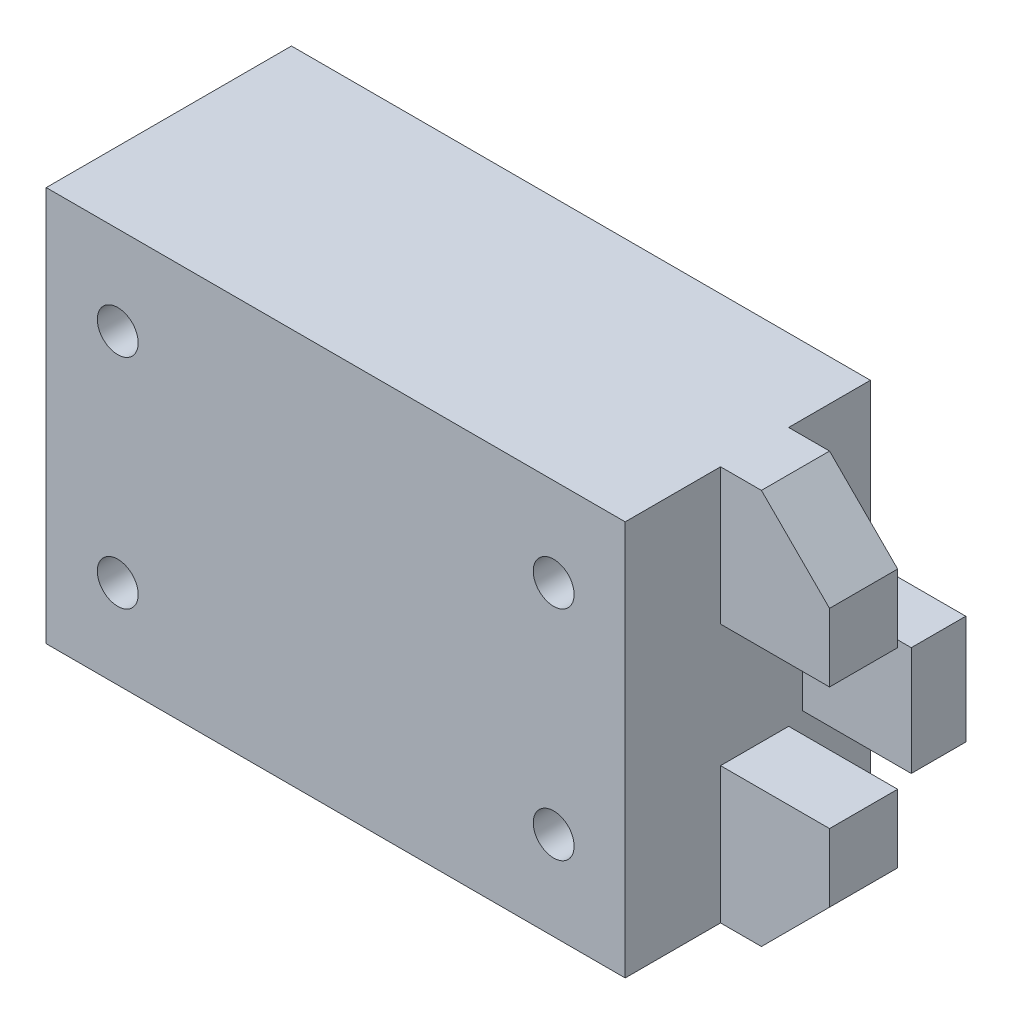
ISO-10303-21;
HEADER;
FILE_DESCRIPTION(('STEP AP214'),'2;1');
FILE_NAME('part.step','',(''),(''),'','','');
FILE_SCHEMA(('AUTOMOTIVE_DESIGN { 1 0 10303 214 1 1 1 1 }'));
ENDSEC;
DATA;
#1=APPLICATION_CONTEXT('core data for automotive mechanical design processes');
#2=APPLICATION_PROTOCOL_DEFINITION('international standard','automotive_design',2000,#1);
#3=PRODUCT_CONTEXT('',#1,'mechanical');
#4=PRODUCT('Part','Part','',(#3));
#5=PRODUCT_RELATED_PRODUCT_CATEGORY('part','',(#4));
#6=PRODUCT_DEFINITION_FORMATION('','',#4);
#7=PRODUCT_DEFINITION_CONTEXT('part definition',#1,'design');
#8=PRODUCT_DEFINITION('design','',#6,#7);
#9=PRODUCT_DEFINITION_SHAPE('','',#8);
#10=(LENGTH_UNIT() NAMED_UNIT(*) SI_UNIT(.MILLI.,.METRE.));
#11=(NAMED_UNIT(*) PLANE_ANGLE_UNIT() SI_UNIT($,.RADIAN.));
#12=(NAMED_UNIT(*) SI_UNIT($,.STERADIAN.) SOLID_ANGLE_UNIT());
#13=UNCERTAINTY_MEASURE_WITH_UNIT(LENGTH_MEASURE(1.E-05),#10,'distance_accuracy_value','');
#14=(GEOMETRIC_REPRESENTATION_CONTEXT(3) GLOBAL_UNCERTAINTY_ASSIGNED_CONTEXT((#13)) GLOBAL_UNIT_ASSIGNED_CONTEXT((#10,
#11,#12)) REPRESENTATION_CONTEXT('',''));
#15=CARTESIAN_POINT('',(0.,0.,0.));
#16=DIRECTION('',(0.,0.,1.));
#17=DIRECTION('',(1.,0.,0.));
#18=AXIS2_PLACEMENT_3D('',#15,#16,#17);
#19=CARTESIAN_POINT('',(85.,0.,36.));
#20=DIRECTION('',(-1.,0.,0.));
#21=DIRECTION('',(0.,0.,1.));
#22=AXIS2_PLACEMENT_3D('',#19,#20,#21);
#23=PLANE('',#22);
#24=DIRECTION('',(0.,1.,0.));
#25=VECTOR('',#24,1.);
#26=CARTESIAN_POINT('',(85.,21.,2.));
#27=LINE('',#26,#25);
#28=CARTESIAN_POINT('',(85.,21.,2.));
#29=VERTEX_POINT('',#28);
#30=CARTESIAN_POINT('',(85.,37.,2.));
#31=VERTEX_POINT('',#30);
#32=EDGE_CURVE('E219',#29,#31,#27,.T.);
#33=ORIENTED_EDGE('',*,*,#32,.F.);
#34=DIRECTION('',(0.,0.,-1.));
#35=VECTOR('',#34,1.);
#36=CARTESIAN_POINT('',(85.,21.,2.));
#37=LINE('',#36,#35);
#38=CARTESIAN_POINT('',(85.,21.,10.));
#39=VERTEX_POINT('',#38);
#40=EDGE_CURVE('E224',#39,#29,#37,.T.);
#41=ORIENTED_EDGE('',*,*,#40,.F.);
#42=DIRECTION('',(0.,-1.,0.));
#43=VECTOR('',#42,1.);
#44=CARTESIAN_POINT('',(85.,21.,10.));
#45=LINE('',#44,#43);
#46=CARTESIAN_POINT('',(85.,37.,10.));
#47=VERTEX_POINT('',#46);
#48=EDGE_CURVE('E236',#47,#39,#45,.T.);
#49=ORIENTED_EDGE('',*,*,#48,.F.);
#50=DIRECTION('',(0.,0.,1.));
#51=VECTOR('',#50,1.);
#52=CARTESIAN_POINT('',(85.,37.,2.));
#53=LINE('',#52,#51);
#54=EDGE_CURVE('E233',#31,#47,#53,.T.);
#55=ORIENTED_EDGE('',*,*,#54,.F.);
#56=EDGE_LOOP('',(#33,#41,#49,#55));
#57=FACE_BOUND('',#56,.T.);
#58=DIRECTION('',(0.,1.,0.));
#59=VECTOR('',#58,1.);
#60=CARTESIAN_POINT('',(85.,0.,12.));
#61=LINE('',#60,#59);
#62=CARTESIAN_POINT('',(85.,0.,12.));
#63=VERTEX_POINT('',#62);
#64=CARTESIAN_POINT('',(85.,20.,12.));
#65=VERTEX_POINT('',#64);
#66=EDGE_CURVE('E189',#63,#65,#61,.T.);
#67=ORIENTED_EDGE('',*,*,#66,.F.);
#68=DIRECTION('',(0.,0.,-1.));
#69=VECTOR('',#68,1.);
#70=CARTESIAN_POINT('',(85.,0.,36.));
#71=LINE('',#70,#69);
#72=CARTESIAN_POINT('',(85.,0.,0.));
#73=VERTEX_POINT('',#72);
#74=EDGE_CURVE('E317',#63,#73,#71,.T.);
#75=ORIENTED_EDGE('',*,*,#74,.T.);
#76=DIRECTION('',(0.,1.,0.));
#77=VECTOR('',#76,1.);
#78=CARTESIAN_POINT('',(85.,0.,0.));
#79=LINE('',#78,#77);
#80=CARTESIAN_POINT('',(85.,58.,0.));
#81=VERTEX_POINT('',#80);
#82=EDGE_CURVE('E307',#73,#81,#79,.T.);
#83=ORIENTED_EDGE('',*,*,#82,.T.);
#84=DIRECTION('',(0.,0.,-1.));
#85=VECTOR('',#84,1.);
#86=CARTESIAN_POINT('',(85.,58.,36.));
#87=LINE('',#86,#85);
#88=CARTESIAN_POINT('',(85.,58.,12.));
#89=VERTEX_POINT('',#88);
#90=EDGE_CURVE('E313',#89,#81,#87,.T.);
#91=ORIENTED_EDGE('',*,*,#90,.F.);
#92=DIRECTION('',(0.,1.,0.));
#93=VECTOR('',#92,1.);
#94=CARTESIAN_POINT('',(85.,58.,12.));
#95=LINE('',#94,#93);
#96=CARTESIAN_POINT('',(85.,38.,12.));
#97=VERTEX_POINT('',#96);
#98=EDGE_CURVE('E190',#97,#89,#95,.T.);
#99=ORIENTED_EDGE('',*,*,#98,.F.);
#100=DIRECTION('',(0.,0.,-1.));
#101=VECTOR('',#100,1.);
#102=CARTESIAN_POINT('',(85.,38.,12.));
#103=LINE('',#102,#101);
#104=CARTESIAN_POINT('',(85.,38.,22.));
#105=VERTEX_POINT('',#104);
#106=EDGE_CURVE('E203',#105,#97,#103,.T.);
#107=ORIENTED_EDGE('',*,*,#106,.F.);
#108=DIRECTION('',(0.,-1.,0.));
#109=VECTOR('',#108,1.);
#110=CARTESIAN_POINT('',(85.,58.,22.));
#111=LINE('',#110,#109);
#112=CARTESIAN_POINT('',(85.,58.,22.));
#113=VERTEX_POINT('',#112);
#114=EDGE_CURVE('E193',#113,#105,#111,.T.);
#115=ORIENTED_EDGE('',*,*,#114,.F.);
#116=CARTESIAN_POINT('',(85.,58.,36.));
#117=VERTEX_POINT('',#116);
#118=EDGE_CURVE('E314',#117,#113,#87,.T.);
#119=ORIENTED_EDGE('',*,*,#118,.F.);
#120=DIRECTION('',(0.,1.,0.));
#121=VECTOR('',#120,1.);
#122=CARTESIAN_POINT('',(85.,0.,36.));
#123=LINE('',#122,#121);
#124=CARTESIAN_POINT('',(85.,0.,36.));
#125=VERTEX_POINT('',#124);
#126=EDGE_CURVE('E297',#125,#117,#123,.T.);
#127=ORIENTED_EDGE('',*,*,#126,.F.);
#128=CARTESIAN_POINT('',(85.,0.,22.));
#129=VERTEX_POINT('',#128);
#130=EDGE_CURVE('E318',#125,#129,#71,.T.);
#131=ORIENTED_EDGE('',*,*,#130,.T.);
#132=DIRECTION('',(0.,-1.,0.));
#133=VECTOR('',#132,1.);
#134=CARTESIAN_POINT('',(85.,0.,22.));
#135=LINE('',#134,#133);
#136=CARTESIAN_POINT('',(85.,20.,22.));
#137=VERTEX_POINT('',#136);
#138=EDGE_CURVE('E174',#137,#129,#135,.T.);
#139=ORIENTED_EDGE('',*,*,#138,.F.);
#140=DIRECTION('',(0.,0.,1.));
#141=VECTOR('',#140,1.);
#142=CARTESIAN_POINT('',(85.,20.,12.));
#143=LINE('',#142,#141);
#144=EDGE_CURVE('E678',#65,#137,#143,.T.);
#145=ORIENTED_EDGE('',*,*,#144,.F.);
#146=EDGE_LOOP('',(#67,#75,#83,#91,#99,#107,#115,#119,#127,#131,#139,#145));
#147=FACE_BOUND('',#146,.T.);
#148=ADVANCED_FACE('F43',(#57,#147),#23,.F.);
#149=CARTESIAN_POINT('',(0.,0.,36.));
#150=DIRECTION('',(0.,0.,-1.));
#151=DIRECTION('',(-1.,0.,0.));
#152=AXIS2_PLACEMENT_3D('',#149,#150,#151);
#153=PLANE('',#152);
#154=CARTESIAN_POINT('',(10.5,13.,36.));
#155=DIRECTION('',(0.,0.,1.));
#156=DIRECTION('',(1.,0.,0.));
#157=AXIS2_PLACEMENT_3D('',#154,#155,#156);
#158=CIRCLE('',#157,3.);
#159=CARTESIAN_POINT('',(13.5,13.,36.));
#160=VERTEX_POINT('',#159);
#161=EDGE_CURVE('E252',#160,#160,#158,.T.);
#162=ORIENTED_EDGE('',*,*,#161,.F.);
#163=EDGE_LOOP('',(#162));
#164=FACE_BOUND('',#163,.T.);
#165=CARTESIAN_POINT('',(74.5,13.,36.));
#166=DIRECTION('',(0.,0.,1.));
#167=DIRECTION('',(1.,0.,0.));
#168=AXIS2_PLACEMENT_3D('',#165,#166,#167);
#169=CIRCLE('',#168,3.00000000000001);
#170=CARTESIAN_POINT('',(77.5,13.,36.));
#171=VERTEX_POINT('',#170);
#172=EDGE_CURVE('E261',#171,#171,#169,.T.);
#173=ORIENTED_EDGE('',*,*,#172,.F.);
#174=EDGE_LOOP('',(#173));
#175=FACE_BOUND('',#174,.T.);
#176=CARTESIAN_POINT('',(74.5,45.,36.));
#177=DIRECTION('',(0.,0.,1.));
#178=DIRECTION('',(1.,0.,0.));
#179=AXIS2_PLACEMENT_3D('',#176,#177,#178);
#180=CIRCLE('',#179,3.00000000000001);
#181=CARTESIAN_POINT('',(77.5,45.,36.));
#182=VERTEX_POINT('',#181);
#183=EDGE_CURVE('E253',#182,#182,#180,.T.);
#184=ORIENTED_EDGE('',*,*,#183,.F.);
#185=EDGE_LOOP('',(#184));
#186=FACE_BOUND('',#185,.T.);
#187=CARTESIAN_POINT('',(10.5,45.,36.));
#188=DIRECTION('',(0.,0.,1.));
#189=DIRECTION('',(1.,0.,0.));
#190=AXIS2_PLACEMENT_3D('',#187,#188,#189);
#191=CIRCLE('',#190,3.);
#192=CARTESIAN_POINT('',(13.5,45.,36.));
#193=VERTEX_POINT('',#192);
#194=EDGE_CURVE('E260',#193,#193,#191,.T.);
#195=ORIENTED_EDGE('',*,*,#194,.F.);
#196=EDGE_LOOP('',(#195));
#197=FACE_BOUND('',#196,.T.);
#198=DIRECTION('',(0.,-1.,0.));
#199=VECTOR('',#198,1.);
#200=CARTESIAN_POINT('',(0.,0.,36.));
#201=LINE('',#200,#199);
#202=CARTESIAN_POINT('',(0.,58.,36.));
#203=VERTEX_POINT('',#202);
#204=CARTESIAN_POINT('',(0.,0.,36.));
#205=VERTEX_POINT('',#204);
#206=EDGE_CURVE('E291',#203,#205,#201,.T.);
#207=ORIENTED_EDGE('',*,*,#206,.T.);
#208=DIRECTION('',(1.,0.,0.));
#209=VECTOR('',#208,1.);
#210=CARTESIAN_POINT('',(0.,0.,36.));
#211=LINE('',#210,#209);
#212=EDGE_CURVE('E294',#205,#125,#211,.T.);
#213=ORIENTED_EDGE('',*,*,#212,.T.);
#214=ORIENTED_EDGE('',*,*,#126,.T.);
#215=DIRECTION('',(-1.,0.,0.));
#216=VECTOR('',#215,1.);
#217=CARTESIAN_POINT('',(0.,58.,36.));
#218=LINE('',#217,#216);
#219=EDGE_CURVE('E299',#117,#203,#218,.T.);
#220=ORIENTED_EDGE('',*,*,#219,.T.);
#221=EDGE_LOOP('',(#207,#213,#214,#220));
#222=FACE_BOUND('',#221,.T.);
#223=ADVANCED_FACE('F389',(#164,#175,#186,#197,#222),#153,.F.);
#224=CARTESIAN_POINT('',(0.,0.,0.));
#225=DIRECTION('',(0.,0.,-1.));
#226=DIRECTION('',(-1.,0.,0.));
#227=AXIS2_PLACEMENT_3D('',#224,#225,#226);
#228=PLANE('',#227);
#229=CARTESIAN_POINT('',(10.5,13.,0.));
#230=DIRECTION('',(0.,0.,1.));
#231=DIRECTION('',(1.,0.,0.));
#232=AXIS2_PLACEMENT_3D('',#229,#230,#231);
#233=CIRCLE('',#232,1.75);
#234=CARTESIAN_POINT('',(12.25,13.,0.));
#235=VERTEX_POINT('',#234);
#236=EDGE_CURVE('E280',#235,#235,#233,.T.);
#237=ORIENTED_EDGE('',*,*,#236,.T.);
#238=EDGE_LOOP('',(#237));
#239=FACE_BOUND('',#238,.T.);
#240=CARTESIAN_POINT('',(10.5,45.,0.));
#241=DIRECTION('',(0.,0.,1.));
#242=DIRECTION('',(1.,0.,0.));
#243=AXIS2_PLACEMENT_3D('',#240,#241,#242);
#244=CIRCLE('',#243,1.75);
#245=CARTESIAN_POINT('',(12.25,45.,0.));
#246=VERTEX_POINT('',#245);
#247=EDGE_CURVE('E287',#246,#246,#244,.T.);
#248=ORIENTED_EDGE('',*,*,#247,.T.);
#249=EDGE_LOOP('',(#248));
#250=FACE_BOUND('',#249,.T.);
#251=DIRECTION('',(0.,-1.,0.));
#252=VECTOR('',#251,1.);
#253=CARTESIAN_POINT('',(0.,0.,0.));
#254=LINE('',#253,#252);
#255=CARTESIAN_POINT('',(0.,58.,0.));
#256=VERTEX_POINT('',#255);
#257=CARTESIAN_POINT('',(0.,0.,0.));
#258=VERTEX_POINT('',#257);
#259=EDGE_CURVE('E290',#256,#258,#254,.T.);
#260=ORIENTED_EDGE('',*,*,#259,.F.);
#261=DIRECTION('',(-1.,0.,0.));
#262=VECTOR('',#261,1.);
#263=CARTESIAN_POINT('',(0.,58.,0.));
#264=LINE('',#263,#262);
#265=EDGE_CURVE('E295',#81,#256,#264,.T.);
#266=ORIENTED_EDGE('',*,*,#265,.F.);
#267=ORIENTED_EDGE('',*,*,#82,.F.);
#268=DIRECTION('',(1.,0.,0.));
#269=VECTOR('',#268,1.);
#270=CARTESIAN_POINT('',(0.,0.,0.));
#271=LINE('',#270,#269);
#272=EDGE_CURVE('E304',#258,#73,#271,.T.);
#273=ORIENTED_EDGE('',*,*,#272,.F.);
#274=EDGE_LOOP('',(#260,#266,#267,#273));
#275=FACE_BOUND('',#274,.T.);
#276=CARTESIAN_POINT('',(74.5,45.,0.));
#277=DIRECTION('',(0.,0.,1.));
#278=DIRECTION('',(1.,0.,0.));
#279=AXIS2_PLACEMENT_3D('',#276,#277,#278);
#280=CIRCLE('',#279,1.75);
#281=CARTESIAN_POINT('',(76.25,45.,0.));
#282=VERTEX_POINT('',#281);
#283=EDGE_CURVE('E284',#282,#282,#280,.T.);
#284=ORIENTED_EDGE('',*,*,#283,.T.);
#285=EDGE_LOOP('',(#284));
#286=FACE_BOUND('',#285,.T.);
#287=CARTESIAN_POINT('',(74.5,13.,0.));
#288=DIRECTION('',(0.,0.,1.));
#289=DIRECTION('',(1.,0.,0.));
#290=AXIS2_PLACEMENT_3D('',#287,#288,#289);
#291=CIRCLE('',#290,1.75);
#292=CARTESIAN_POINT('',(76.25,13.,0.));
#293=VERTEX_POINT('',#292);
#294=EDGE_CURVE('E277',#293,#293,#291,.T.);
#295=ORIENTED_EDGE('',*,*,#294,.T.);
#296=EDGE_LOOP('',(#295));
#297=FACE_BOUND('',#296,.T.);
#298=ADVANCED_FACE('F383',(#239,#250,#275,#286,#297),#228,.T.);
#299=CARTESIAN_POINT('',(0.,0.,36.));
#300=DIRECTION('',(1.,0.,0.));
#301=DIRECTION('',(0.,0.,-1.));
#302=AXIS2_PLACEMENT_3D('',#299,#300,#301);
#303=PLANE('',#302);
#304=ORIENTED_EDGE('',*,*,#259,.T.);
#305=DIRECTION('',(0.,0.,-1.));
#306=VECTOR('',#305,1.);
#307=CARTESIAN_POINT('',(0.,0.,36.));
#308=LINE('',#307,#306);
#309=EDGE_CURVE('E321',#205,#258,#308,.T.);
#310=ORIENTED_EDGE('',*,*,#309,.F.);
#311=ORIENTED_EDGE('',*,*,#206,.F.);
#312=DIRECTION('',(0.,0.,-1.));
#313=VECTOR('',#312,1.);
#314=CARTESIAN_POINT('',(0.,58.,36.));
#315=LINE('',#314,#313);
#316=EDGE_CURVE('E301',#203,#256,#315,.T.);
#317=ORIENTED_EDGE('',*,*,#316,.T.);
#318=EDGE_LOOP('',(#304,#310,#311,#317));
#319=FACE_BOUND('',#318,.T.);
#320=ADVANCED_FACE('F381',(#319),#303,.F.);
#321=CARTESIAN_POINT('',(0.,0.,36.));
#322=DIRECTION('',(0.,1.,0.));
#323=DIRECTION('',(0.,0.,1.));
#324=AXIS2_PLACEMENT_3D('',#321,#322,#323);
#325=PLANE('',#324);
#326=DIRECTION('',(-1.,0.,0.));
#327=VECTOR('',#326,1.);
#328=CARTESIAN_POINT('',(101.,0.,12.));
#329=LINE('',#328,#327);
#330=CARTESIAN_POINT('',(91.,0.,12.));
#331=VERTEX_POINT('',#330);
#332=EDGE_CURVE('E674',#331,#63,#329,.T.);
#333=ORIENTED_EDGE('',*,*,#332,.F.);
#334=DIRECTION('',(0.,0.,1.));
#335=VECTOR('',#334,1.);
#336=CARTESIAN_POINT('',(91.,0.,22.));
#337=LINE('',#336,#335);
#338=CARTESIAN_POINT('',(91.,0.,22.));
#339=VERTEX_POINT('',#338);
#340=EDGE_CURVE('E51',#331,#339,#337,.T.);
#341=ORIENTED_EDGE('',*,*,#340,.T.);
#342=DIRECTION('',(-1.,0.,0.));
#343=VECTOR('',#342,1.);
#344=CARTESIAN_POINT('',(101.,0.,22.));
#345=LINE('',#344,#343);
#346=EDGE_CURVE('E195',#339,#129,#345,.T.);
#347=ORIENTED_EDGE('',*,*,#346,.T.);
#348=ORIENTED_EDGE('',*,*,#130,.F.);
#349=ORIENTED_EDGE('',*,*,#212,.F.);
#350=ORIENTED_EDGE('',*,*,#309,.T.);
#351=ORIENTED_EDGE('',*,*,#272,.T.);
#352=ORIENTED_EDGE('',*,*,#74,.F.);
#353=EDGE_LOOP('',(#333,#341,#347,#348,#349,#350,#351,#352));
#354=FACE_BOUND('',#353,.T.);
#355=ADVANCED_FACE('F386',(#354),#325,.F.);
#356=CARTESIAN_POINT('',(0.,58.,36.));
#357=DIRECTION('',(0.,-1.,0.));
#358=DIRECTION('',(0.,0.,-1.));
#359=AXIS2_PLACEMENT_3D('',#356,#357,#358);
#360=PLANE('',#359);
#361=DIRECTION('',(-1.,0.,0.));
#362=VECTOR('',#361,1.);
#363=CARTESIAN_POINT('',(101.,58.,22.));
#364=LINE('',#363,#362);
#365=CARTESIAN_POINT('',(91.,58.,22.));
#366=VERTEX_POINT('',#365);
#367=EDGE_CURVE('E215',#366,#113,#364,.T.);
#368=ORIENTED_EDGE('',*,*,#367,.F.);
#369=DIRECTION('',(0.,0.,-1.));
#370=VECTOR('',#369,1.);
#371=CARTESIAN_POINT('',(91.,58.,36.));
#372=LINE('',#371,#370);
#373=CARTESIAN_POINT('',(91.,58.,12.));
#374=VERTEX_POINT('',#373);
#375=EDGE_CURVE('E339',#366,#374,#372,.T.);
#376=ORIENTED_EDGE('',*,*,#375,.T.);
#377=DIRECTION('',(-1.,0.,0.));
#378=VECTOR('',#377,1.);
#379=CARTESIAN_POINT('',(101.,58.,12.));
#380=LINE('',#379,#378);
#381=EDGE_CURVE('E217',#374,#89,#380,.T.);
#382=ORIENTED_EDGE('',*,*,#381,.T.);
#383=ORIENTED_EDGE('',*,*,#90,.T.);
#384=ORIENTED_EDGE('',*,*,#265,.T.);
#385=ORIENTED_EDGE('',*,*,#316,.F.);
#386=ORIENTED_EDGE('',*,*,#219,.F.);
#387=ORIENTED_EDGE('',*,*,#118,.T.);
#388=EDGE_LOOP('',(#368,#376,#382,#383,#384,#385,#386,#387));
#389=FACE_BOUND('',#388,.T.);
#390=ADVANCED_FACE('F364',(#389),#360,.F.);
#391=CARTESIAN_POINT('',(10.5,45.,36.));
#392=DIRECTION('',(0.,0.,-1.));
#393=DIRECTION('',(-1.,0.,0.));
#394=AXIS2_PLACEMENT_3D('',#391,#392,#393);
#395=CYLINDRICAL_SURFACE('',#394,1.75);
#396=CARTESIAN_POINT('',(10.5,45.,5.));
#397=DIRECTION('',(0.,0.,-1.));
#398=DIRECTION('',(-1.,0.,0.));
#399=AXIS2_PLACEMENT_3D('',#396,#397,#398);
#400=CIRCLE('',#399,1.75);
#401=CARTESIAN_POINT('',(8.75000000000001,45.,5.));
#402=VERTEX_POINT('',#401);
#403=EDGE_CURVE('E281',#402,#402,#400,.T.);
#404=ORIENTED_EDGE('',*,*,#403,.F.);
#405=EDGE_LOOP('',(#404));
#406=FACE_BOUND('',#405,.T.);
#407=ORIENTED_EDGE('',*,*,#247,.F.);
#408=EDGE_LOOP('',(#407));
#409=FACE_BOUND('',#408,.T.);
#410=ADVANCED_FACE('F406',(#406,#409),#395,.F.);
#411=CARTESIAN_POINT('',(74.5,45.,36.));
#412=DIRECTION('',(0.,0.,-1.));
#413=DIRECTION('',(-1.,0.,0.));
#414=AXIS2_PLACEMENT_3D('',#411,#412,#413);
#415=CYLINDRICAL_SURFACE('',#414,1.75);
#416=CARTESIAN_POINT('',(74.5,45.,5.));
#417=DIRECTION('',(0.,0.,-1.));
#418=DIRECTION('',(-1.,0.,0.));
#419=AXIS2_PLACEMENT_3D('',#416,#417,#418);
#420=CIRCLE('',#419,1.75);
#421=CARTESIAN_POINT('',(72.75,45.,5.));
#422=VERTEX_POINT('',#421);
#423=EDGE_CURVE('E330',#422,#422,#420,.T.);
#424=ORIENTED_EDGE('',*,*,#423,.F.);
#425=EDGE_LOOP('',(#424));
#426=FACE_BOUND('',#425,.T.);
#427=ORIENTED_EDGE('',*,*,#283,.F.);
#428=EDGE_LOOP('',(#427));
#429=FACE_BOUND('',#428,.T.);
#430=ADVANCED_FACE('F497',(#426,#429),#415,.F.);
#431=CARTESIAN_POINT('',(10.5,13.,36.));
#432=DIRECTION('',(0.,0.,-1.));
#433=DIRECTION('',(-1.,0.,0.));
#434=AXIS2_PLACEMENT_3D('',#431,#432,#433);
#435=CYLINDRICAL_SURFACE('',#434,1.75);
#436=CARTESIAN_POINT('',(10.5,13.,5.));
#437=DIRECTION('',(0.,0.,-1.));
#438=DIRECTION('',(-1.,0.,0.));
#439=AXIS2_PLACEMENT_3D('',#436,#437,#438);
#440=CIRCLE('',#439,1.75);
#441=CARTESIAN_POINT('',(8.75000000000001,13.,5.));
#442=VERTEX_POINT('',#441);
#443=EDGE_CURVE('E327',#442,#442,#440,.T.);
#444=ORIENTED_EDGE('',*,*,#443,.F.);
#445=EDGE_LOOP('',(#444));
#446=FACE_BOUND('',#445,.T.);
#447=ORIENTED_EDGE('',*,*,#236,.F.);
#448=EDGE_LOOP('',(#447));
#449=FACE_BOUND('',#448,.T.);
#450=ADVANCED_FACE('F494',(#446,#449),#435,.F.);
#451=CARTESIAN_POINT('',(74.5,13.,36.));
#452=DIRECTION('',(0.,0.,-1.));
#453=DIRECTION('',(-1.,0.,0.));
#454=AXIS2_PLACEMENT_3D('',#451,#452,#453);
#455=CYLINDRICAL_SURFACE('',#454,1.75);
#456=CARTESIAN_POINT('',(74.5,13.,5.));
#457=DIRECTION('',(0.,0.,-1.));
#458=DIRECTION('',(-1.,0.,0.));
#459=AXIS2_PLACEMENT_3D('',#456,#457,#458);
#460=CIRCLE('',#459,1.75);
#461=CARTESIAN_POINT('',(72.75,13.,5.));
#462=VERTEX_POINT('',#461);
#463=EDGE_CURVE('E276',#462,#462,#460,.T.);
#464=ORIENTED_EDGE('',*,*,#463,.F.);
#465=EDGE_LOOP('',(#464));
#466=FACE_BOUND('',#465,.T.);
#467=ORIENTED_EDGE('',*,*,#294,.F.);
#468=EDGE_LOOP('',(#467));
#469=FACE_BOUND('',#468,.T.);
#470=ADVANCED_FACE('F478',(#466,#469),#455,.F.);
#471=CARTESIAN_POINT('',(0.,0.,5.));
#472=DIRECTION('',(0.,0.,-1.));
#473=DIRECTION('',(-1.,0.,0.));
#474=AXIS2_PLACEMENT_3D('',#471,#472,#473);
#475=PLANE('',#474);
#476=ORIENTED_EDGE('',*,*,#463,.T.);
#477=EDGE_LOOP('',(#476));
#478=FACE_BOUND('',#477,.T.);
#479=CARTESIAN_POINT('',(74.5,13.,5.));
#480=DIRECTION('',(0.,0.,-1.));
#481=DIRECTION('',(-1.,0.,0.));
#482=AXIS2_PLACEMENT_3D('',#479,#480,#481);
#483=CIRCLE('',#482,3.00000000000001);
#484=CARTESIAN_POINT('',(71.5,13.,5.));
#485=VERTEX_POINT('',#484);
#486=EDGE_CURVE('E257',#485,#485,#483,.F.);
#487=ORIENTED_EDGE('',*,*,#486,.T.);
#488=EDGE_LOOP('',(#487));
#489=FACE_BOUND('',#488,.T.);
#490=ADVANCED_FACE('F474',(#478,#489),#475,.F.);
#491=CARTESIAN_POINT('',(74.5,13.,-8.48528137423858));
#492=DIRECTION('',(0.,0.,1.));
#493=DIRECTION('',(1.,0.,0.));
#494=AXIS2_PLACEMENT_3D('',#491,#492,#493);
#495=CYLINDRICAL_SURFACE('',#494,3.00000000000001);
#496=ORIENTED_EDGE('',*,*,#172,.T.);
#497=EDGE_LOOP('',(#496));
#498=FACE_BOUND('',#497,.T.);
#499=ORIENTED_EDGE('',*,*,#486,.F.);
#500=EDGE_LOOP('',(#499));
#501=FACE_BOUND('',#500,.T.);
#502=ADVANCED_FACE('F470',(#498,#501),#495,.F.);
#503=CARTESIAN_POINT('',(0.,0.,5.));
#504=DIRECTION('',(0.,0.,-1.));
#505=DIRECTION('',(-1.,0.,0.));
#506=AXIS2_PLACEMENT_3D('',#503,#504,#505);
#507=PLANE('',#506);
#508=ORIENTED_EDGE('',*,*,#443,.T.);
#509=EDGE_LOOP('',(#508));
#510=FACE_BOUND('',#509,.T.);
#511=CARTESIAN_POINT('',(10.5,13.,5.));
#512=DIRECTION('',(0.,0.,-1.));
#513=DIRECTION('',(-1.,0.,0.));
#514=AXIS2_PLACEMENT_3D('',#511,#512,#513);
#515=CIRCLE('',#514,3.);
#516=CARTESIAN_POINT('',(7.50000000000001,13.,5.));
#517=VERTEX_POINT('',#516);
#518=EDGE_CURVE('E264',#517,#517,#515,.F.);
#519=ORIENTED_EDGE('',*,*,#518,.T.);
#520=EDGE_LOOP('',(#519));
#521=FACE_BOUND('',#520,.T.);
#522=ADVANCED_FACE('F473',(#510,#521),#507,.F.);
#523=CARTESIAN_POINT('',(10.5,13.,-8.48528137423858));
#524=DIRECTION('',(0.,0.,1.));
#525=DIRECTION('',(1.,0.,0.));
#526=AXIS2_PLACEMENT_3D('',#523,#524,#525);
#527=CYLINDRICAL_SURFACE('',#526,3.);
#528=ORIENTED_EDGE('',*,*,#161,.T.);
#529=EDGE_LOOP('',(#528));
#530=FACE_BOUND('',#529,.T.);
#531=ORIENTED_EDGE('',*,*,#518,.F.);
#532=EDGE_LOOP('',(#531));
#533=FACE_BOUND('',#532,.T.);
#534=ADVANCED_FACE('F468',(#530,#533),#527,.F.);
#535=CARTESIAN_POINT('',(0.,0.,5.));
#536=DIRECTION('',(0.,0.,-1.));
#537=DIRECTION('',(-1.,0.,0.));
#538=AXIS2_PLACEMENT_3D('',#535,#536,#537);
#539=PLANE('',#538);
#540=ORIENTED_EDGE('',*,*,#423,.T.);
#541=EDGE_LOOP('',(#540));
#542=FACE_BOUND('',#541,.T.);
#543=CARTESIAN_POINT('',(74.5,45.,5.));
#544=DIRECTION('',(0.,0.,-1.));
#545=DIRECTION('',(-1.,0.,0.));
#546=AXIS2_PLACEMENT_3D('',#543,#544,#545);
#547=CIRCLE('',#546,3.00000000000001);
#548=CARTESIAN_POINT('',(71.5,45.,5.));
#549=VERTEX_POINT('',#548);
#550=EDGE_CURVE('E256',#549,#549,#547,.F.);
#551=ORIENTED_EDGE('',*,*,#550,.T.);
#552=EDGE_LOOP('',(#551));
#553=FACE_BOUND('',#552,.T.);
#554=ADVANCED_FACE('F464',(#542,#553),#539,.F.);
#555=CARTESIAN_POINT('',(74.5,45.,-8.48528137423858));
#556=DIRECTION('',(0.,0.,1.));
#557=DIRECTION('',(1.,0.,0.));
#558=AXIS2_PLACEMENT_3D('',#555,#556,#557);
#559=CYLINDRICAL_SURFACE('',#558,3.00000000000001);
#560=ORIENTED_EDGE('',*,*,#183,.T.);
#561=EDGE_LOOP('',(#560));
#562=FACE_BOUND('',#561,.T.);
#563=ORIENTED_EDGE('',*,*,#550,.F.);
#564=EDGE_LOOP('',(#563));
#565=FACE_BOUND('',#564,.T.);
#566=ADVANCED_FACE('F460',(#562,#565),#559,.F.);
#567=CARTESIAN_POINT('',(0.,0.,5.));
#568=DIRECTION('',(0.,0.,-1.));
#569=DIRECTION('',(-1.,0.,0.));
#570=AXIS2_PLACEMENT_3D('',#567,#568,#569);
#571=PLANE('',#570);
#572=ORIENTED_EDGE('',*,*,#403,.T.);
#573=EDGE_LOOP('',(#572));
#574=FACE_BOUND('',#573,.T.);
#575=CARTESIAN_POINT('',(10.5,45.,5.));
#576=DIRECTION('',(0.,0.,-1.));
#577=DIRECTION('',(-1.,0.,0.));
#578=AXIS2_PLACEMENT_3D('',#575,#576,#577);
#579=CIRCLE('',#578,3.);
#580=CARTESIAN_POINT('',(7.50000000000001,45.,5.));
#581=VERTEX_POINT('',#580);
#582=EDGE_CURVE('E273',#581,#581,#579,.F.);
#583=ORIENTED_EDGE('',*,*,#582,.T.);
#584=EDGE_LOOP('',(#583));
#585=FACE_BOUND('',#584,.T.);
#586=ADVANCED_FACE('F463',(#574,#585),#571,.F.);
#587=CARTESIAN_POINT('',(10.5,45.,-8.48528137423858));
#588=DIRECTION('',(0.,0.,1.));
#589=DIRECTION('',(1.,0.,0.));
#590=AXIS2_PLACEMENT_3D('',#587,#588,#589);
#591=CYLINDRICAL_SURFACE('',#590,3.);
#592=ORIENTED_EDGE('',*,*,#194,.T.);
#593=EDGE_LOOP('',(#592));
#594=FACE_BOUND('',#593,.T.);
#595=ORIENTED_EDGE('',*,*,#582,.F.);
#596=EDGE_LOOP('',(#595));
#597=FACE_BOUND('',#596,.T.);
#598=ADVANCED_FACE('F458',(#594,#597),#591,.F.);
#599=CARTESIAN_POINT('',(101.,21.,2.));
#600=DIRECTION('',(0.,0.,1.));
#601=DIRECTION('',(1.,0.,0.));
#602=AXIS2_PLACEMENT_3D('',#599,#600,#601);
#603=PLANE('',#602);
#604=ORIENTED_EDGE('',*,*,#32,.T.);
#605=DIRECTION('',(-1.,0.,0.));
#606=VECTOR('',#605,1.);
#607=CARTESIAN_POINT('',(101.,37.,2.));
#608=LINE('',#607,#606);
#609=CARTESIAN_POINT('',(101.,37.,2.));
#610=VERTEX_POINT('',#609);
#611=EDGE_CURVE('E249',#610,#31,#608,.T.);
#612=ORIENTED_EDGE('',*,*,#611,.F.);
#613=DIRECTION('',(0.,1.,0.));
#614=VECTOR('',#613,1.);
#615=CARTESIAN_POINT('',(101.,21.,2.));
#616=LINE('',#615,#614);
#617=CARTESIAN_POINT('',(101.,21.,2.));
#618=VERTEX_POINT('',#617);
#619=EDGE_CURVE('E220',#618,#610,#616,.T.);
#620=ORIENTED_EDGE('',*,*,#619,.F.);
#621=DIRECTION('',(-1.,0.,0.));
#622=VECTOR('',#621,1.);
#623=CARTESIAN_POINT('',(101.,21.,2.));
#624=LINE('',#623,#622);
#625=EDGE_CURVE('E230',#618,#29,#624,.T.);
#626=ORIENTED_EDGE('',*,*,#625,.T.);
#627=EDGE_LOOP('',(#604,#612,#620,#626));
#628=FACE_BOUND('',#627,.T.);
#629=ADVANCED_FACE('F454',(#628),#603,.F.);
#630=CARTESIAN_POINT('',(101.,37.,2.));
#631=DIRECTION('',(0.,-1.,0.));
#632=DIRECTION('',(0.,0.,-1.));
#633=AXIS2_PLACEMENT_3D('',#630,#631,#632);
#634=PLANE('',#633);
#635=ORIENTED_EDGE('',*,*,#54,.T.);
#636=DIRECTION('',(-1.,0.,0.));
#637=VECTOR('',#636,1.);
#638=CARTESIAN_POINT('',(101.,37.,10.));
#639=LINE('',#638,#637);
#640=CARTESIAN_POINT('',(101.,37.,10.));
#641=VERTEX_POINT('',#640);
#642=EDGE_CURVE('E246',#641,#47,#639,.T.);
#643=ORIENTED_EDGE('',*,*,#642,.F.);
#644=DIRECTION('',(0.,0.,1.));
#645=VECTOR('',#644,1.);
#646=CARTESIAN_POINT('',(101.,37.,2.));
#647=LINE('',#646,#645);
#648=EDGE_CURVE('E223',#610,#641,#647,.T.);
#649=ORIENTED_EDGE('',*,*,#648,.F.);
#650=ORIENTED_EDGE('',*,*,#611,.T.);
#651=EDGE_LOOP('',(#635,#643,#649,#650));
#652=FACE_BOUND('',#651,.T.);
#653=ADVANCED_FACE('F450',(#652),#634,.F.);
#654=CARTESIAN_POINT('',(101.,21.,10.));
#655=DIRECTION('',(0.,0.,-1.));
#656=DIRECTION('',(-1.,0.,0.));
#657=AXIS2_PLACEMENT_3D('',#654,#655,#656);
#658=PLANE('',#657);
#659=ORIENTED_EDGE('',*,*,#48,.T.);
#660=DIRECTION('',(-1.,0.,0.));
#661=VECTOR('',#660,1.);
#662=CARTESIAN_POINT('',(101.,21.,10.));
#663=LINE('',#662,#661);
#664=CARTESIAN_POINT('',(101.,21.,10.));
#665=VERTEX_POINT('',#664);
#666=EDGE_CURVE('E243',#665,#39,#663,.T.);
#667=ORIENTED_EDGE('',*,*,#666,.F.);
#668=DIRECTION('',(0.,-1.,0.));
#669=VECTOR('',#668,1.);
#670=CARTESIAN_POINT('',(101.,21.,10.));
#671=LINE('',#670,#669);
#672=EDGE_CURVE('E226',#641,#665,#671,.T.);
#673=ORIENTED_EDGE('',*,*,#672,.F.);
#674=ORIENTED_EDGE('',*,*,#642,.T.);
#675=EDGE_LOOP('',(#659,#667,#673,#674));
#676=FACE_BOUND('',#675,.T.);
#677=ADVANCED_FACE('F446',(#676),#658,.F.);
#678=CARTESIAN_POINT('',(101.,21.,2.));
#679=DIRECTION('',(0.,1.,0.));
#680=DIRECTION('',(0.,0.,1.));
#681=AXIS2_PLACEMENT_3D('',#678,#679,#680);
#682=PLANE('',#681);
#683=ORIENTED_EDGE('',*,*,#40,.T.);
#684=ORIENTED_EDGE('',*,*,#625,.F.);
#685=DIRECTION('',(0.,0.,-1.));
#686=VECTOR('',#685,1.);
#687=CARTESIAN_POINT('',(101.,21.,2.));
#688=LINE('',#687,#686);
#689=EDGE_CURVE('E228',#665,#618,#688,.T.);
#690=ORIENTED_EDGE('',*,*,#689,.F.);
#691=ORIENTED_EDGE('',*,*,#666,.T.);
#692=EDGE_LOOP('',(#683,#684,#690,#691));
#693=FACE_BOUND('',#692,.T.);
#694=ADVANCED_FACE('F442',(#693),#682,.F.);
#695=CARTESIAN_POINT('',(101.,0.,0.));
#696=DIRECTION('',(1.,0.,0.));
#697=DIRECTION('',(0.,0.,-1.));
#698=AXIS2_PLACEMENT_3D('',#695,#696,#697);
#699=PLANE('',#698);
#700=ORIENTED_EDGE('',*,*,#619,.T.);
#701=ORIENTED_EDGE('',*,*,#648,.T.);
#702=ORIENTED_EDGE('',*,*,#672,.T.);
#703=ORIENTED_EDGE('',*,*,#689,.T.);
#704=EDGE_LOOP('',(#700,#701,#702,#703));
#705=FACE_BOUND('',#704,.T.);
#706=ADVANCED_FACE('F439',(#705),#699,.T.);
#707=CARTESIAN_POINT('',(101.,58.,12.));
#708=DIRECTION('',(0.,0.,1.));
#709=DIRECTION('',(0.,-1.,0.));
#710=AXIS2_PLACEMENT_3D('',#707,#708,#709);
#711=PLANE('',#710);
#712=ORIENTED_EDGE('',*,*,#381,.F.);
#713=DIRECTION('',(-0.707106781186549,0.707106781186546,0.));
#714=VECTOR('',#713,1.);
#715=CARTESIAN_POINT('',(101.,48.,12.));
#716=LINE('',#715,#714);
#717=CARTESIAN_POINT('',(101.,48.,12.));
#718=VERTEX_POINT('',#717);
#719=EDGE_CURVE('E341',#374,#718,#716,.F.);
#720=ORIENTED_EDGE('',*,*,#719,.T.);
#721=DIRECTION('',(0.,1.,0.));
#722=VECTOR('',#721,1.);
#723=CARTESIAN_POINT('',(101.,58.,12.));
#724=LINE('',#723,#722);
#725=CARTESIAN_POINT('',(101.,38.,12.));
#726=VERTEX_POINT('',#725);
#727=EDGE_CURVE('E199',#726,#718,#724,.T.);
#728=ORIENTED_EDGE('',*,*,#727,.F.);
#729=DIRECTION('',(-1.,0.,0.));
#730=VECTOR('',#729,1.);
#731=CARTESIAN_POINT('',(101.,38.,12.));
#732=LINE('',#731,#730);
#733=EDGE_CURVE('E206',#726,#97,#732,.T.);
#734=ORIENTED_EDGE('',*,*,#733,.T.);
#735=ORIENTED_EDGE('',*,*,#98,.T.);
#736=EDGE_LOOP('',(#712,#720,#728,#734,#735));
#737=FACE_BOUND('',#736,.T.);
#738=ADVANCED_FACE('F348',(#737),#711,.F.);
#739=CARTESIAN_POINT('',(101.,58.,22.));
#740=DIRECTION('',(0.,0.,-1.));
#741=DIRECTION('',(-1.,0.,0.));
#742=AXIS2_PLACEMENT_3D('',#739,#740,#741);
#743=PLANE('',#742);
#744=DIRECTION('',(0.,-1.,0.));
#745=VECTOR('',#744,1.);
#746=CARTESIAN_POINT('',(101.,58.,22.));
#747=LINE('',#746,#745);
#748=CARTESIAN_POINT('',(101.,48.,22.));
#749=VERTEX_POINT('',#748);
#750=CARTESIAN_POINT('',(101.,38.,22.));
#751=VERTEX_POINT('',#750);
#752=EDGE_CURVE('E202',#749,#751,#747,.T.);
#753=ORIENTED_EDGE('',*,*,#752,.F.);
#754=DIRECTION('',(0.707106781186549,-0.707106781186546,0.));
#755=VECTOR('',#754,1.);
#756=CARTESIAN_POINT('',(101.,48.,22.));
#757=LINE('',#756,#755);
#758=EDGE_CURVE('E337',#749,#366,#757,.F.);
#759=ORIENTED_EDGE('',*,*,#758,.T.);
#760=ORIENTED_EDGE('',*,*,#367,.T.);
#761=ORIENTED_EDGE('',*,*,#114,.T.);
#762=DIRECTION('',(-1.,0.,0.));
#763=VECTOR('',#762,1.);
#764=CARTESIAN_POINT('',(101.,38.,22.));
#765=LINE('',#764,#763);
#766=EDGE_CURVE('E212',#751,#105,#765,.T.);
#767=ORIENTED_EDGE('',*,*,#766,.F.);
#768=EDGE_LOOP('',(#753,#759,#760,#761,#767));
#769=FACE_BOUND('',#768,.T.);
#770=ADVANCED_FACE('F360',(#769),#743,.F.);
#771=CARTESIAN_POINT('',(101.,38.,12.));
#772=DIRECTION('',(0.,1.,0.));
#773=DIRECTION('',(0.,0.,1.));
#774=AXIS2_PLACEMENT_3D('',#771,#772,#773);
#775=PLANE('',#774);
#776=ORIENTED_EDGE('',*,*,#106,.T.);
#777=ORIENTED_EDGE('',*,*,#733,.F.);
#778=DIRECTION('',(0.,0.,-1.));
#779=VECTOR('',#778,1.);
#780=CARTESIAN_POINT('',(101.,38.,12.));
#781=LINE('',#780,#779);
#782=EDGE_CURVE('E205',#751,#726,#781,.T.);
#783=ORIENTED_EDGE('',*,*,#782,.F.);
#784=ORIENTED_EDGE('',*,*,#766,.T.);
#785=EDGE_LOOP('',(#776,#777,#783,#784));
#786=FACE_BOUND('',#785,.T.);
#787=ADVANCED_FACE('F373',(#786),#775,.F.);
#788=CARTESIAN_POINT('',(101.,0.,0.));
#789=DIRECTION('',(-1.,0.,0.));
#790=DIRECTION('',(0.,0.,1.));
#791=AXIS2_PLACEMENT_3D('',#788,#789,#790);
#792=PLANE('',#791);
#793=ORIENTED_EDGE('',*,*,#727,.T.);
#794=DIRECTION('',(0.,0.,1.));
#795=VECTOR('',#794,1.);
#796=CARTESIAN_POINT('',(101.,48.,0.));
#797=LINE('',#796,#795);
#798=EDGE_CURVE('E324',#718,#749,#797,.T.);
#799=ORIENTED_EDGE('',*,*,#798,.T.);
#800=ORIENTED_EDGE('',*,*,#752,.T.);
#801=ORIENTED_EDGE('',*,*,#782,.T.);
#802=EDGE_LOOP('',(#793,#799,#800,#801));
#803=FACE_BOUND('',#802,.T.);
#804=ADVANCED_FACE('F353',(#803),#792,.F.);
#805=CARTESIAN_POINT('',(101.,0.,12.));
#806=DIRECTION('',(0.,0.,1.));
#807=DIRECTION('',(1.,0.,0.));
#808=AXIS2_PLACEMENT_3D('',#805,#806,#807);
#809=PLANE('',#808);
#810=DIRECTION('',(0.,1.,0.));
#811=VECTOR('',#810,1.);
#812=CARTESIAN_POINT('',(101.,0.,12.));
#813=LINE('',#812,#811);
#814=CARTESIAN_POINT('',(101.,9.99999999999998,12.));
#815=VERTEX_POINT('',#814);
#816=CARTESIAN_POINT('',(101.,20.,12.));
#817=VERTEX_POINT('',#816);
#818=EDGE_CURVE('E165',#815,#817,#813,.T.);
#819=ORIENTED_EDGE('',*,*,#818,.F.);
#820=DIRECTION('',(-0.707106781186549,-0.707106781186546,0.));
#821=VECTOR('',#820,1.);
#822=CARTESIAN_POINT('',(101.,9.99999999999998,12.));
#823=LINE('',#822,#821);
#824=EDGE_CURVE('E65',#815,#331,#823,.T.);
#825=ORIENTED_EDGE('',*,*,#824,.T.);
#826=ORIENTED_EDGE('',*,*,#332,.T.);
#827=ORIENTED_EDGE('',*,*,#66,.T.);
#828=DIRECTION('',(-1.,0.,0.));
#829=VECTOR('',#828,1.);
#830=CARTESIAN_POINT('',(101.,20.,12.));
#831=LINE('',#830,#829);
#832=EDGE_CURVE('E180',#817,#65,#831,.T.);
#833=ORIENTED_EDGE('',*,*,#832,.F.);
#834=EDGE_LOOP('',(#819,#825,#826,#827,#833));
#835=FACE_BOUND('',#834,.T.);
#836=ADVANCED_FACE('F187',(#835),#809,.F.);
#837=CARTESIAN_POINT('',(101.,20.,12.));
#838=DIRECTION('',(0.,-1.,0.));
#839=DIRECTION('',(0.,0.,-1.));
#840=AXIS2_PLACEMENT_3D('',#837,#838,#839);
#841=PLANE('',#840);
#842=ORIENTED_EDGE('',*,*,#144,.T.);
#843=DIRECTION('',(-1.,0.,0.));
#844=VECTOR('',#843,1.);
#845=CARTESIAN_POINT('',(101.,20.,22.));
#846=LINE('',#845,#844);
#847=CARTESIAN_POINT('',(101.,20.,22.));
#848=VERTEX_POINT('',#847);
#849=EDGE_CURVE('E183',#848,#137,#846,.T.);
#850=ORIENTED_EDGE('',*,*,#849,.F.);
#851=DIRECTION('',(0.,0.,1.));
#852=VECTOR('',#851,1.);
#853=CARTESIAN_POINT('',(101.,20.,12.));
#854=LINE('',#853,#852);
#855=EDGE_CURVE('E169',#817,#848,#854,.T.);
#856=ORIENTED_EDGE('',*,*,#855,.F.);
#857=ORIENTED_EDGE('',*,*,#832,.T.);
#858=EDGE_LOOP('',(#842,#850,#856,#857));
#859=FACE_BOUND('',#858,.T.);
#860=ADVANCED_FACE('F179',(#859),#841,.F.);
#861=CARTESIAN_POINT('',(101.,0.,22.));
#862=DIRECTION('',(0.,0.,-1.));
#863=DIRECTION('',(-1.,0.,0.));
#864=AXIS2_PLACEMENT_3D('',#861,#862,#863);
#865=PLANE('',#864);
#866=ORIENTED_EDGE('',*,*,#346,.F.);
#867=DIRECTION('',(0.707106781186549,0.707106781186546,0.));
#868=VECTOR('',#867,1.);
#869=CARTESIAN_POINT('',(101.,9.99999999999998,22.));
#870=LINE('',#869,#868);
#871=CARTESIAN_POINT('',(101.,9.99999999999998,22.));
#872=VERTEX_POINT('',#871);
#873=EDGE_CURVE('E12',#339,#872,#870,.T.);
#874=ORIENTED_EDGE('',*,*,#873,.T.);
#875=DIRECTION('',(0.,-1.,0.));
#876=VECTOR('',#875,1.);
#877=CARTESIAN_POINT('',(101.,0.,22.));
#878=LINE('',#877,#876);
#879=EDGE_CURVE('E185',#848,#872,#878,.T.);
#880=ORIENTED_EDGE('',*,*,#879,.F.);
#881=ORIENTED_EDGE('',*,*,#849,.T.);
#882=ORIENTED_EDGE('',*,*,#138,.T.);
#883=EDGE_LOOP('',(#866,#874,#880,#881,#882));
#884=FACE_BOUND('',#883,.T.);
#885=ADVANCED_FACE('F419',(#884),#865,.F.);
#886=CARTESIAN_POINT('',(101.,0.,0.));
#887=DIRECTION('',(1.,0.,0.));
#888=DIRECTION('',(0.,0.,-1.));
#889=AXIS2_PLACEMENT_3D('',#886,#887,#888);
#890=PLANE('',#889);
#891=ORIENTED_EDGE('',*,*,#879,.T.);
#892=DIRECTION('',(0.,0.,-1.));
#893=VECTOR('',#892,1.);
#894=CARTESIAN_POINT('',(101.,9.99999999999998,12.));
#895=LINE('',#894,#893);
#896=EDGE_CURVE('E172',#872,#815,#895,.T.);
#897=ORIENTED_EDGE('',*,*,#896,.T.);
#898=ORIENTED_EDGE('',*,*,#818,.T.);
#899=ORIENTED_EDGE('',*,*,#855,.T.);
#900=EDGE_LOOP('',(#891,#897,#898,#899));
#901=FACE_BOUND('',#900,.T.);
#902=ADVANCED_FACE('F168',(#901),#890,.T.);
#903=CARTESIAN_POINT('',(101.,48.,0.));
#904=DIRECTION('',(-0.707106781186546,-0.707106781186549,0.));
#905=DIRECTION('',(0.,0.,1.));
#906=AXIS2_PLACEMENT_3D('',#903,#904,#905);
#907=PLANE('',#906);
#908=ORIENTED_EDGE('',*,*,#719,.F.);
#909=ORIENTED_EDGE('',*,*,#375,.F.);
#910=ORIENTED_EDGE('',*,*,#758,.F.);
#911=ORIENTED_EDGE('',*,*,#798,.F.);
#912=EDGE_LOOP('',(#908,#909,#910,#911));
#913=FACE_BOUND('',#912,.T.);
#914=ADVANCED_FACE('F357',(#913),#907,.F.);
#915=CARTESIAN_POINT('',(101.,9.99999999999998,0.));
#916=DIRECTION('',(0.707106781186546,-0.707106781186549,0.));
#917=DIRECTION('',(0.,0.,1.));
#918=AXIS2_PLACEMENT_3D('',#915,#916,#917);
#919=PLANE('',#918);
#920=ORIENTED_EDGE('',*,*,#873,.F.);
#921=ORIENTED_EDGE('',*,*,#340,.F.);
#922=ORIENTED_EDGE('',*,*,#824,.F.);
#923=ORIENTED_EDGE('',*,*,#896,.F.);
#924=EDGE_LOOP('',(#920,#921,#922,#923));
#925=FACE_BOUND('',#924,.T.);
#926=ADVANCED_FACE('F45',(#925),#919,.T.);
#927=CLOSED_SHELL('',(#148,#223,#298,#320,#355,#390,#410,#430,#450,#470,#490,#502,#522,#534,
#554,#566,#586,#598,#629,#653,#677,#694,#706,#738,#770,#787,#804,#836,#860,#885,#902,#914,#926));
#928=MANIFOLD_SOLID_BREP('B2',#927);
#929=ADVANCED_BREP_SHAPE_REPRESENTATION('',(#18,#928),#14);
#930=SHAPE_DEFINITION_REPRESENTATION(#9,#929);
ENDSEC;
END-ISO-10303-21;
